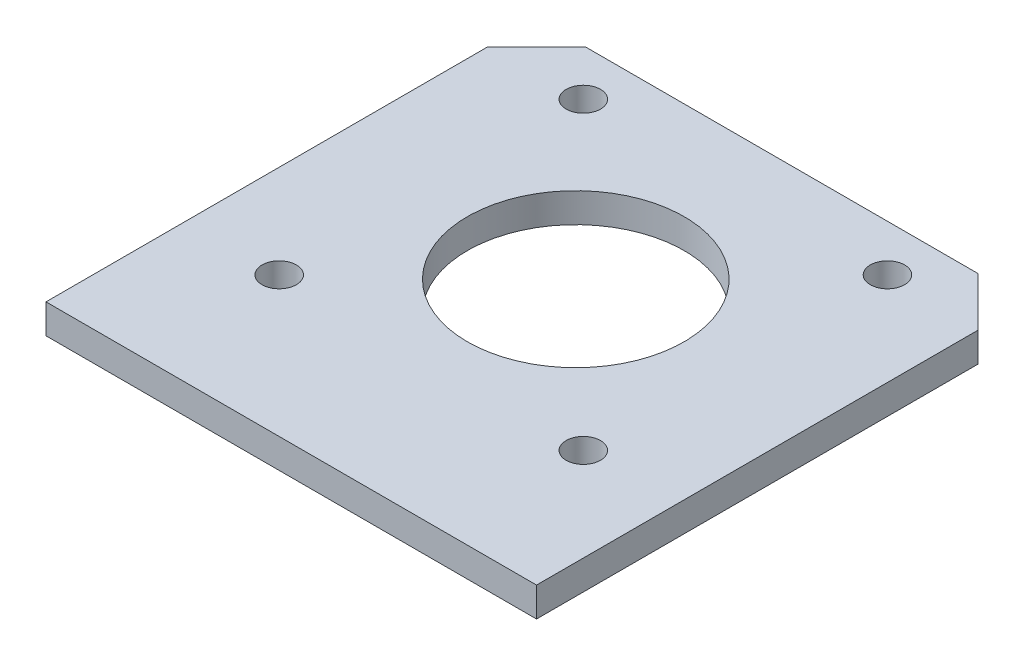
ISO-10303-21;
HEADER;
FILE_DESCRIPTION(('STEP AP214'),'2;1');
FILE_NAME('part.step','',(''),(''),'','','');
FILE_SCHEMA(('AUTOMOTIVE_DESIGN { 1 0 10303 214 1 1 1 1 }'));
ENDSEC;
DATA;
#1=APPLICATION_CONTEXT('core data for automotive mechanical design processes');
#2=APPLICATION_PROTOCOL_DEFINITION('international standard','automotive_design',2000,#1);
#3=PRODUCT_CONTEXT('',#1,'mechanical');
#4=PRODUCT('Part','Part','',(#3));
#5=PRODUCT_RELATED_PRODUCT_CATEGORY('part','',(#4));
#6=PRODUCT_DEFINITION_FORMATION('','',#4);
#7=PRODUCT_DEFINITION_CONTEXT('part definition',#1,'design');
#8=PRODUCT_DEFINITION('design','',#6,#7);
#9=PRODUCT_DEFINITION_SHAPE('','',#8);
#10=(LENGTH_UNIT() NAMED_UNIT(*) SI_UNIT(.MILLI.,.METRE.));
#11=(NAMED_UNIT(*) PLANE_ANGLE_UNIT() SI_UNIT($,.RADIAN.));
#12=(NAMED_UNIT(*) SI_UNIT($,.STERADIAN.) SOLID_ANGLE_UNIT());
#13=UNCERTAINTY_MEASURE_WITH_UNIT(LENGTH_MEASURE(1.E-05),#10,'distance_accuracy_value','');
#14=(GEOMETRIC_REPRESENTATION_CONTEXT(3) GLOBAL_UNCERTAINTY_ASSIGNED_CONTEXT((#13)) GLOBAL_UNIT_ASSIGNED_CONTEXT((#10,
#11,#12)) REPRESENTATION_CONTEXT('',''));
#15=CARTESIAN_POINT('',(0.,0.,0.));
#16=DIRECTION('',(0.,0.,1.));
#17=DIRECTION('',(1.,0.,0.));
#18=AXIS2_PLACEMENT_3D('',#15,#16,#17);
#19=CARTESIAN_POINT('',(0.,3.,0.));
#20=DIRECTION('',(0.,1.,0.));
#21=DIRECTION('',(0.,0.,1.));
#22=AXIS2_PLACEMENT_3D('',#19,#20,#21);
#23=PLANE('',#22);
#24=CARTESIAN_POINT('',(15.5,3.,14.7291008331656));
#25=DIRECTION('',(0.,1.,0.));
#26=DIRECTION('',(0.,0.,-1.));
#27=AXIS2_PLACEMENT_3D('',#24,#25,#26);
#28=CIRCLE('',#27,1.75);
#29=CARTESIAN_POINT('',(15.5,3.,12.9791008331656));
#30=VERTEX_POINT('',#29);
#31=EDGE_CURVE('E216',#30,#30,#28,.T.);
#32=ORIENTED_EDGE('',*,*,#31,.F.);
#33=EDGE_LOOP('',(#32));
#34=FACE_BOUND('',#33,.T.);
#35=CARTESIAN_POINT('',(15.5,3.,-16.2708991668344));
#36=DIRECTION('',(0.,1.,0.));
#37=DIRECTION('',(0.,0.,-1.));
#38=AXIS2_PLACEMENT_3D('',#35,#36,#37);
#39=CIRCLE('',#38,1.75);
#40=CARTESIAN_POINT('',(15.5,3.,-18.0208991668344));
#41=VERTEX_POINT('',#40);
#42=EDGE_CURVE('E232',#41,#41,#39,.T.);
#43=ORIENTED_EDGE('',*,*,#42,.F.);
#44=EDGE_LOOP('',(#43));
#45=FACE_BOUND('',#44,.T.);
#46=DIRECTION('',(0.,0.,-1.));
#47=VECTOR('',#46,1.);
#48=CARTESIAN_POINT('',(25.,3.,-16.));
#49=LINE('',#48,#47);
#50=CARTESIAN_POINT('',(25.,3.,29.));
#51=VERTEX_POINT('',#50);
#52=CARTESIAN_POINT('',(25.,3.,-16.));
#53=VERTEX_POINT('',#52);
#54=EDGE_CURVE('E146',#51,#53,#49,.T.);
#55=ORIENTED_EDGE('',*,*,#54,.T.);
#56=DIRECTION('',(-0.707106781186548,0.,-0.707106781186548));
#57=VECTOR('',#56,1.);
#58=CARTESIAN_POINT('',(20.,3.,-21.));
#59=LINE('',#58,#57);
#60=CARTESIAN_POINT('',(20.,3.,-21.));
#61=VERTEX_POINT('',#60);
#62=EDGE_CURVE('E94',#53,#61,#59,.T.);
#63=ORIENTED_EDGE('',*,*,#62,.T.);
#64=DIRECTION('',(-1.,0.,0.));
#65=VECTOR('',#64,1.);
#66=CARTESIAN_POINT('',(-20.,3.,-21.));
#67=LINE('',#66,#65);
#68=CARTESIAN_POINT('',(-20.,3.,-21.));
#69=VERTEX_POINT('',#68);
#70=EDGE_CURVE('E107',#61,#69,#67,.T.);
#71=ORIENTED_EDGE('',*,*,#70,.T.);
#72=DIRECTION('',(-0.707106781186548,0.,0.707106781186548));
#73=VECTOR('',#72,1.);
#74=CARTESIAN_POINT('',(-20.,3.,-21.));
#75=LINE('',#74,#73);
#76=CARTESIAN_POINT('',(-25.,3.,-16.));
#77=VERTEX_POINT('',#76);
#78=EDGE_CURVE('E101',#69,#77,#75,.T.);
#79=ORIENTED_EDGE('',*,*,#78,.T.);
#80=DIRECTION('',(0.,0.,1.));
#81=VECTOR('',#80,1.);
#82=CARTESIAN_POINT('',(-25.,3.,-16.));
#83=LINE('',#82,#81);
#84=CARTESIAN_POINT('',(-25.,3.,29.));
#85=VERTEX_POINT('',#84);
#86=EDGE_CURVE('E105',#77,#85,#83,.T.);
#87=ORIENTED_EDGE('',*,*,#86,.T.);
#88=DIRECTION('',(1.,0.,0.));
#89=VECTOR('',#88,1.);
#90=CARTESIAN_POINT('',(-25.,3.,29.));
#91=LINE('',#90,#89);
#92=EDGE_CURVE('E57',#85,#51,#91,.T.);
#93=ORIENTED_EDGE('',*,*,#92,.T.);
#94=EDGE_LOOP('',(#55,#63,#71,#79,#87,#93));
#95=FACE_BOUND('',#94,.T.);
#96=CARTESIAN_POINT('',(0.,3.,0.));
#97=DIRECTION('',(0.,1.,0.));
#98=DIRECTION('',(0.,0.,1.));
#99=AXIS2_PLACEMENT_3D('',#96,#97,#98);
#100=CIRCLE('',#99,11.05);
#101=CARTESIAN_POINT('',(0.,3.,11.05));
#102=VERTEX_POINT('',#101);
#103=EDGE_CURVE('E134',#102,#102,#100,.T.);
#104=ORIENTED_EDGE('',*,*,#103,.F.);
#105=EDGE_LOOP('',(#104));
#106=FACE_BOUND('',#105,.T.);
#107=CARTESIAN_POINT('',(-15.5,3.,-16.2708991668344));
#108=DIRECTION('',(0.,1.,0.));
#109=DIRECTION('',(0.,0.,1.));
#110=AXIS2_PLACEMENT_3D('',#107,#108,#109);
#111=CIRCLE('',#110,1.75);
#112=CARTESIAN_POINT('',(-15.5,3.,-14.5208991668344));
#113=VERTEX_POINT('',#112);
#114=EDGE_CURVE('E224',#113,#113,#111,.T.);
#115=ORIENTED_EDGE('',*,*,#114,.F.);
#116=EDGE_LOOP('',(#115));
#117=FACE_BOUND('',#116,.T.);
#118=CARTESIAN_POINT('',(-15.5,3.,14.7291008331656));
#119=DIRECTION('',(0.,1.,0.));
#120=DIRECTION('',(0.,0.,1.));
#121=AXIS2_PLACEMENT_3D('',#118,#119,#120);
#122=CIRCLE('',#121,1.75);
#123=CARTESIAN_POINT('',(-15.5,3.,16.4791008331656));
#124=VERTEX_POINT('',#123);
#125=EDGE_CURVE('E205',#124,#124,#122,.T.);
#126=ORIENTED_EDGE('',*,*,#125,.F.);
#127=EDGE_LOOP('',(#126));
#128=FACE_BOUND('',#127,.T.);
#129=ADVANCED_FACE('F39',(#34,#45,#95,#106,#117,#128),#23,.T.);
#130=CARTESIAN_POINT('',(0.,0.,0.));
#131=DIRECTION('',(0.,1.,0.));
#132=DIRECTION('',(0.,0.,1.));
#133=AXIS2_PLACEMENT_3D('',#130,#131,#132);
#134=PLANE('',#133);
#135=DIRECTION('',(0.,0.,-1.));
#136=VECTOR('',#135,1.);
#137=CARTESIAN_POINT('',(25.,0.,-16.));
#138=LINE('',#137,#136);
#139=CARTESIAN_POINT('',(25.,0.,29.));
#140=VERTEX_POINT('',#139);
#141=CARTESIAN_POINT('',(25.,0.,-16.));
#142=VERTEX_POINT('',#141);
#143=EDGE_CURVE('E129',#140,#142,#138,.T.);
#144=ORIENTED_EDGE('',*,*,#143,.F.);
#145=DIRECTION('',(1.,0.,0.));
#146=VECTOR('',#145,1.);
#147=CARTESIAN_POINT('',(-25.,0.,29.));
#148=LINE('',#147,#146);
#149=CARTESIAN_POINT('',(-25.,0.,29.));
#150=VERTEX_POINT('',#149);
#151=EDGE_CURVE('E86',#150,#140,#148,.T.);
#152=ORIENTED_EDGE('',*,*,#151,.F.);
#153=DIRECTION('',(0.,0.,1.));
#154=VECTOR('',#153,1.);
#155=CARTESIAN_POINT('',(-25.,0.,-16.));
#156=LINE('',#155,#154);
#157=CARTESIAN_POINT('',(-25.,0.,-16.));
#158=VERTEX_POINT('',#157);
#159=EDGE_CURVE('E80',#158,#150,#156,.T.);
#160=ORIENTED_EDGE('',*,*,#159,.F.);
#161=DIRECTION('',(-0.707106781186548,0.,0.707106781186548));
#162=VECTOR('',#161,1.);
#163=CARTESIAN_POINT('',(-20.,0.,-21.));
#164=LINE('',#163,#162);
#165=CARTESIAN_POINT('',(-20.,0.,-21.));
#166=VERTEX_POINT('',#165);
#167=EDGE_CURVE('E116',#166,#158,#164,.T.);
#168=ORIENTED_EDGE('',*,*,#167,.F.);
#169=DIRECTION('',(-1.,0.,0.));
#170=VECTOR('',#169,1.);
#171=CARTESIAN_POINT('',(-20.,0.,-21.));
#172=LINE('',#171,#170);
#173=CARTESIAN_POINT('',(20.,0.,-21.));
#174=VERTEX_POINT('',#173);
#175=EDGE_CURVE('E137',#174,#166,#172,.T.);
#176=ORIENTED_EDGE('',*,*,#175,.F.);
#177=DIRECTION('',(-0.707106781186548,0.,-0.707106781186548));
#178=VECTOR('',#177,1.);
#179=CARTESIAN_POINT('',(20.,0.,-21.));
#180=LINE('',#179,#178);
#181=EDGE_CURVE('E133',#142,#174,#180,.T.);
#182=ORIENTED_EDGE('',*,*,#181,.F.);
#183=EDGE_LOOP('',(#144,#152,#160,#168,#176,#182));
#184=FACE_BOUND('',#183,.T.);
#185=CARTESIAN_POINT('',(0.,0.,0.));
#186=DIRECTION('',(0.,1.,0.));
#187=DIRECTION('',(0.,0.,1.));
#188=AXIS2_PLACEMENT_3D('',#185,#186,#187);
#189=CIRCLE('',#188,11.05);
#190=CARTESIAN_POINT('',(0.,0.,11.05));
#191=VERTEX_POINT('',#190);
#192=EDGE_CURVE('E236',#191,#191,#189,.T.);
#193=ORIENTED_EDGE('',*,*,#192,.T.);
#194=EDGE_LOOP('',(#193));
#195=FACE_BOUND('',#194,.T.);
#196=CARTESIAN_POINT('',(15.5,0.,-16.2708991668344));
#197=DIRECTION('',(0.,1.,0.));
#198=DIRECTION('',(0.,0.,-1.));
#199=AXIS2_PLACEMENT_3D('',#196,#197,#198);
#200=CIRCLE('',#199,1.75);
#201=CARTESIAN_POINT('',(15.5,0.,-18.0208991668344));
#202=VERTEX_POINT('',#201);
#203=EDGE_CURVE('E228',#202,#202,#200,.T.);
#204=ORIENTED_EDGE('',*,*,#203,.T.);
#205=EDGE_LOOP('',(#204));
#206=FACE_BOUND('',#205,.T.);
#207=CARTESIAN_POINT('',(-15.5,0.,-16.2708991668344));
#208=DIRECTION('',(0.,1.,0.));
#209=DIRECTION('',(0.,0.,1.));
#210=AXIS2_PLACEMENT_3D('',#207,#208,#209);
#211=CIRCLE('',#210,1.75);
#212=CARTESIAN_POINT('',(-15.5,0.,-14.5208991668344));
#213=VERTEX_POINT('',#212);
#214=EDGE_CURVE('E220',#213,#213,#211,.T.);
#215=ORIENTED_EDGE('',*,*,#214,.T.);
#216=EDGE_LOOP('',(#215));
#217=FACE_BOUND('',#216,.T.);
#218=CARTESIAN_POINT('',(15.5,0.,14.7291008331656));
#219=DIRECTION('',(0.,1.,0.));
#220=DIRECTION('',(0.,0.,-1.));
#221=AXIS2_PLACEMENT_3D('',#218,#219,#220);
#222=CIRCLE('',#221,1.75);
#223=CARTESIAN_POINT('',(15.5,0.,12.9791008331656));
#224=VERTEX_POINT('',#223);
#225=EDGE_CURVE('E213',#224,#224,#222,.T.);
#226=ORIENTED_EDGE('',*,*,#225,.T.);
#227=EDGE_LOOP('',(#226));
#228=FACE_BOUND('',#227,.T.);
#229=CARTESIAN_POINT('',(-15.5,0.,14.7291008331656));
#230=DIRECTION('',(0.,1.,0.));
#231=DIRECTION('',(0.,0.,1.));
#232=AXIS2_PLACEMENT_3D('',#229,#230,#231);
#233=CIRCLE('',#232,1.75);
#234=CARTESIAN_POINT('',(-15.5,0.,16.4791008331656));
#235=VERTEX_POINT('',#234);
#236=EDGE_CURVE('E208',#235,#235,#233,.T.);
#237=ORIENTED_EDGE('',*,*,#236,.T.);
#238=EDGE_LOOP('',(#237));
#239=FACE_BOUND('',#238,.T.);
#240=ADVANCED_FACE('F159',(#184,#195,#206,#217,#228,#239),#134,.F.);
#241=CARTESIAN_POINT('',(25.,3.,-16.));
#242=DIRECTION('',(-1.,0.,0.));
#243=DIRECTION('',(0.,0.,1.));
#244=AXIS2_PLACEMENT_3D('',#241,#242,#243);
#245=PLANE('',#244);
#246=ORIENTED_EDGE('',*,*,#143,.T.);
#247=DIRECTION('',(0.,-1.,0.));
#248=VECTOR('',#247,1.);
#249=CARTESIAN_POINT('',(25.,3.,-16.));
#250=LINE('',#249,#248);
#251=EDGE_CURVE('E11',#53,#142,#250,.T.);
#252=ORIENTED_EDGE('',*,*,#251,.F.);
#253=ORIENTED_EDGE('',*,*,#54,.F.);
#254=DIRECTION('',(0.,-1.,0.));
#255=VECTOR('',#254,1.);
#256=CARTESIAN_POINT('',(25.,3.,29.));
#257=LINE('',#256,#255);
#258=EDGE_CURVE('E125',#51,#140,#257,.T.);
#259=ORIENTED_EDGE('',*,*,#258,.T.);
#260=EDGE_LOOP('',(#246,#252,#253,#259));
#261=FACE_BOUND('',#260,.T.);
#262=ADVANCED_FACE('F41',(#261),#245,.F.);
#263=CARTESIAN_POINT('',(20.,3.,-21.));
#264=DIRECTION('',(-0.707106781186547,0.,0.707106781186547));
#265=DIRECTION('',(0.707106781186548,0.,0.707106781186548));
#266=AXIS2_PLACEMENT_3D('',#263,#264,#265);
#267=PLANE('',#266);
#268=ORIENTED_EDGE('',*,*,#181,.T.);
#269=DIRECTION('',(0.,-1.,0.));
#270=VECTOR('',#269,1.);
#271=CARTESIAN_POINT('',(20.,3.,-21.));
#272=LINE('',#271,#270);
#273=EDGE_CURVE('E49',#61,#174,#272,.T.);
#274=ORIENTED_EDGE('',*,*,#273,.F.);
#275=ORIENTED_EDGE('',*,*,#62,.F.);
#276=ORIENTED_EDGE('',*,*,#251,.T.);
#277=EDGE_LOOP('',(#268,#274,#275,#276));
#278=FACE_BOUND('',#277,.T.);
#279=ADVANCED_FACE('F309',(#278),#267,.F.);
#280=CARTESIAN_POINT('',(-20.,3.,-21.));
#281=DIRECTION('',(0.,0.,1.));
#282=DIRECTION('',(1.,0.,0.));
#283=AXIS2_PLACEMENT_3D('',#280,#281,#282);
#284=PLANE('',#283);
#285=ORIENTED_EDGE('',*,*,#175,.T.);
#286=DIRECTION('',(0.,-1.,0.));
#287=VECTOR('',#286,1.);
#288=CARTESIAN_POINT('',(-20.,3.,-21.));
#289=LINE('',#288,#287);
#290=EDGE_CURVE('E118',#69,#166,#289,.T.);
#291=ORIENTED_EDGE('',*,*,#290,.F.);
#292=ORIENTED_EDGE('',*,*,#70,.F.);
#293=ORIENTED_EDGE('',*,*,#273,.T.);
#294=EDGE_LOOP('',(#285,#291,#292,#293));
#295=FACE_BOUND('',#294,.T.);
#296=ADVANCED_FACE('F156',(#295),#284,.F.);
#297=CARTESIAN_POINT('',(-20.,3.,-21.));
#298=DIRECTION('',(0.707106781186547,0.,0.707106781186547));
#299=DIRECTION('',(0.707106781186548,0.,-0.707106781186548));
#300=AXIS2_PLACEMENT_3D('',#297,#298,#299);
#301=PLANE('',#300);
#302=ORIENTED_EDGE('',*,*,#167,.T.);
#303=DIRECTION('',(0.,-1.,0.));
#304=VECTOR('',#303,1.);
#305=CARTESIAN_POINT('',(-25.,3.,-16.));
#306=LINE('',#305,#304);
#307=EDGE_CURVE('E113',#77,#158,#306,.T.);
#308=ORIENTED_EDGE('',*,*,#307,.F.);
#309=ORIENTED_EDGE('',*,*,#78,.F.);
#310=ORIENTED_EDGE('',*,*,#290,.T.);
#311=EDGE_LOOP('',(#302,#308,#309,#310));
#312=FACE_BOUND('',#311,.T.);
#313=ADVANCED_FACE('F114',(#312),#301,.F.);
#314=CARTESIAN_POINT('',(-25.,3.,-16.));
#315=DIRECTION('',(1.,0.,0.));
#316=DIRECTION('',(0.,0.,-1.));
#317=AXIS2_PLACEMENT_3D('',#314,#315,#316);
#318=PLANE('',#317);
#319=ORIENTED_EDGE('',*,*,#159,.T.);
#320=DIRECTION('',(0.,-1.,0.));
#321=VECTOR('',#320,1.);
#322=CARTESIAN_POINT('',(-25.,3.,29.));
#323=LINE('',#322,#321);
#324=EDGE_CURVE('E119',#85,#150,#323,.T.);
#325=ORIENTED_EDGE('',*,*,#324,.F.);
#326=ORIENTED_EDGE('',*,*,#86,.F.);
#327=ORIENTED_EDGE('',*,*,#307,.T.);
#328=EDGE_LOOP('',(#319,#325,#326,#327));
#329=FACE_BOUND('',#328,.T.);
#330=ADVANCED_FACE('F121',(#329),#318,.F.);
#331=CARTESIAN_POINT('',(-25.,3.,29.));
#332=DIRECTION('',(0.,0.,-1.));
#333=DIRECTION('',(-1.,0.,0.));
#334=AXIS2_PLACEMENT_3D('',#331,#332,#333);
#335=PLANE('',#334);
#336=ORIENTED_EDGE('',*,*,#151,.T.);
#337=ORIENTED_EDGE('',*,*,#258,.F.);
#338=ORIENTED_EDGE('',*,*,#92,.F.);
#339=ORIENTED_EDGE('',*,*,#324,.T.);
#340=EDGE_LOOP('',(#336,#337,#338,#339));
#341=FACE_BOUND('',#340,.T.);
#342=ADVANCED_FACE('F164',(#341),#335,.F.);
#343=CARTESIAN_POINT('',(0.,3.,0.));
#344=DIRECTION('',(0.,-1.,0.));
#345=DIRECTION('',(0.,0.,-1.));
#346=AXIS2_PLACEMENT_3D('',#343,#344,#345);
#347=CYLINDRICAL_SURFACE('',#346,11.05);
#348=ORIENTED_EDGE('',*,*,#103,.T.);
#349=EDGE_LOOP('',(#348));
#350=FACE_BOUND('',#349,.T.);
#351=ORIENTED_EDGE('',*,*,#192,.F.);
#352=EDGE_LOOP('',(#351));
#353=FACE_BOUND('',#352,.T.);
#354=ADVANCED_FACE('F166',(#350,#353),#347,.F.);
#355=CARTESIAN_POINT('',(15.5,3.,-16.2708991668344));
#356=DIRECTION('',(0.,-1.,0.));
#357=DIRECTION('',(0.,0.,-1.));
#358=AXIS2_PLACEMENT_3D('',#355,#356,#357);
#359=CYLINDRICAL_SURFACE('',#358,1.75);
#360=ORIENTED_EDGE('',*,*,#42,.T.);
#361=EDGE_LOOP('',(#360));
#362=FACE_BOUND('',#361,.T.);
#363=ORIENTED_EDGE('',*,*,#203,.F.);
#364=EDGE_LOOP('',(#363));
#365=FACE_BOUND('',#364,.T.);
#366=ADVANCED_FACE('F172',(#362,#365),#359,.F.);
#367=CARTESIAN_POINT('',(-15.5,3.,-16.2708991668344));
#368=DIRECTION('',(0.,-1.,0.));
#369=DIRECTION('',(0.,0.,-1.));
#370=AXIS2_PLACEMENT_3D('',#367,#368,#369);
#371=CYLINDRICAL_SURFACE('',#370,1.75);
#372=ORIENTED_EDGE('',*,*,#114,.T.);
#373=EDGE_LOOP('',(#372));
#374=FACE_BOUND('',#373,.T.);
#375=ORIENTED_EDGE('',*,*,#214,.F.);
#376=EDGE_LOOP('',(#375));
#377=FACE_BOUND('',#376,.T.);
#378=ADVANCED_FACE('F188',(#374,#377),#371,.F.);
#379=CARTESIAN_POINT('',(15.5,3.,14.7291008331656));
#380=DIRECTION('',(0.,-1.,0.));
#381=DIRECTION('',(0.,0.,-1.));
#382=AXIS2_PLACEMENT_3D('',#379,#380,#381);
#383=CYLINDRICAL_SURFACE('',#382,1.75);
#384=ORIENTED_EDGE('',*,*,#31,.T.);
#385=EDGE_LOOP('',(#384));
#386=FACE_BOUND('',#385,.T.);
#387=ORIENTED_EDGE('',*,*,#225,.F.);
#388=EDGE_LOOP('',(#387));
#389=FACE_BOUND('',#388,.T.);
#390=ADVANCED_FACE('F192',(#386,#389),#383,.F.);
#391=CARTESIAN_POINT('',(-15.5,3.,14.7291008331656));
#392=DIRECTION('',(0.,-1.,0.));
#393=DIRECTION('',(0.,0.,-1.));
#394=AXIS2_PLACEMENT_3D('',#391,#392,#393);
#395=CYLINDRICAL_SURFACE('',#394,1.75);
#396=ORIENTED_EDGE('',*,*,#125,.T.);
#397=EDGE_LOOP('',(#396));
#398=FACE_BOUND('',#397,.T.);
#399=ORIENTED_EDGE('',*,*,#236,.F.);
#400=EDGE_LOOP('',(#399));
#401=FACE_BOUND('',#400,.T.);
#402=ADVANCED_FACE('F196',(#398,#401),#395,.F.);
#403=CLOSED_SHELL('',(#129,#240,#262,#279,#296,#313,#330,#342,#354,#366,#378,#390,#402));
#404=MANIFOLD_SOLID_BREP('B2',#403);
#405=ADVANCED_BREP_SHAPE_REPRESENTATION('',(#18,#404),#14);
#406=SHAPE_DEFINITION_REPRESENTATION(#9,#405);
ENDSEC;
END-ISO-10303-21;
